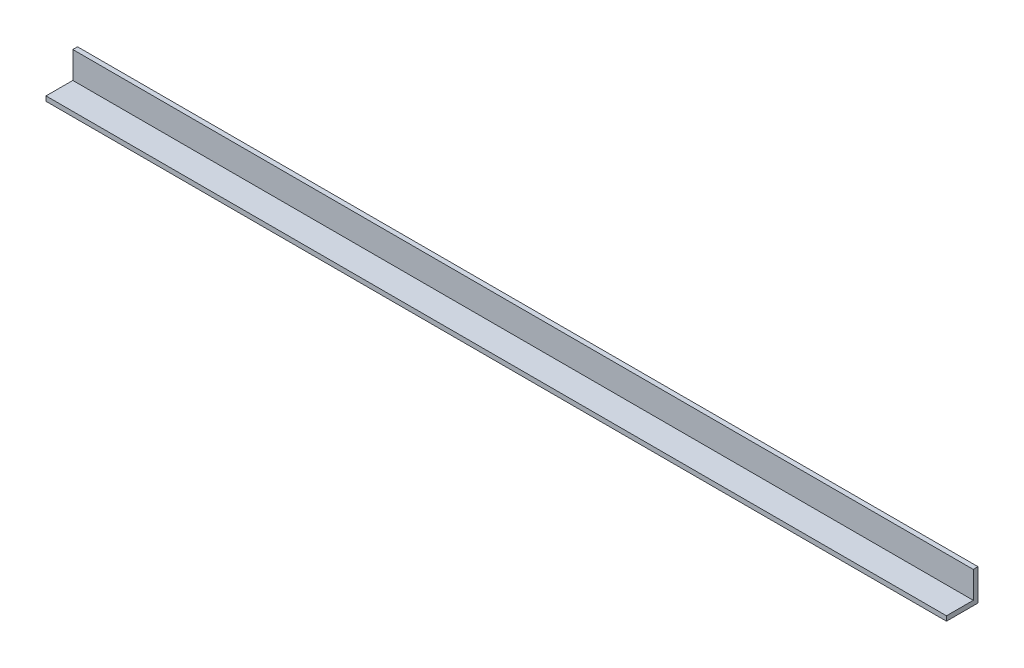
ISO-10303-21;
HEADER;
FILE_DESCRIPTION(('STEP AP214'),'2;1');
FILE_NAME('part.step','',(''),(''),'','','');
FILE_SCHEMA(('AUTOMOTIVE_DESIGN { 1 0 10303 214 1 1 1 1 }'));
ENDSEC;
DATA;
#1=APPLICATION_CONTEXT('core data for automotive mechanical design processes');
#2=APPLICATION_PROTOCOL_DEFINITION('international standard','automotive_design',2000,#1);
#3=PRODUCT_CONTEXT('',#1,'mechanical');
#4=PRODUCT('Part','Part','',(#3));
#5=PRODUCT_RELATED_PRODUCT_CATEGORY('part','',(#4));
#6=PRODUCT_DEFINITION_FORMATION('','',#4);
#7=PRODUCT_DEFINITION_CONTEXT('part definition',#1,'design');
#8=PRODUCT_DEFINITION('design','',#6,#7);
#9=PRODUCT_DEFINITION_SHAPE('','',#8);
#10=(LENGTH_UNIT() NAMED_UNIT(*) SI_UNIT(.MILLI.,.METRE.));
#11=(NAMED_UNIT(*) PLANE_ANGLE_UNIT() SI_UNIT($,.RADIAN.));
#12=(NAMED_UNIT(*) SI_UNIT($,.STERADIAN.) SOLID_ANGLE_UNIT());
#13=UNCERTAINTY_MEASURE_WITH_UNIT(LENGTH_MEASURE(1.E-05),#10,'distance_accuracy_value','');
#14=(GEOMETRIC_REPRESENTATION_CONTEXT(3) GLOBAL_UNCERTAINTY_ASSIGNED_CONTEXT((#13)) GLOBAL_UNIT_ASSIGNED_CONTEXT((#10,
#11,#12)) REPRESENTATION_CONTEXT('',''));
#15=CARTESIAN_POINT('',(0.,0.,0.));
#16=DIRECTION('',(0.,0.,1.));
#17=DIRECTION('',(1.,0.,0.));
#18=AXIS2_PLACEMENT_3D('',#15,#16,#17);
#19=CARTESIAN_POINT('',(0.,0.,80.));
#20=DIRECTION('',(1.,0.,0.));
#21=DIRECTION('',(0.,0.,-1.));
#22=AXIS2_PLACEMENT_3D('',#19,#20,#21);
#23=PLANE('',#22);
#24=DIRECTION('',(0.,0.,1.));
#25=VECTOR('',#24,1.);
#26=CARTESIAN_POINT('',(0.,12.,12.));
#27=LINE('',#26,#25);
#28=CARTESIAN_POINT('',(0.,12.,12.));
#29=VERTEX_POINT('',#28);
#30=CARTESIAN_POINT('',(0.,12.,80.));
#31=VERTEX_POINT('',#30);
#32=EDGE_CURVE('E46',#29,#31,#27,.T.);
#33=ORIENTED_EDGE('',*,*,#32,.F.);
#34=DIRECTION('',(0.,-1.,0.));
#35=VECTOR('',#34,1.);
#36=CARTESIAN_POINT('',(0.,80.,12.));
#37=LINE('',#36,#35);
#38=CARTESIAN_POINT('',(0.,80.,12.));
#39=VERTEX_POINT('',#38);
#40=EDGE_CURVE('E82',#39,#29,#37,.T.);
#41=ORIENTED_EDGE('',*,*,#40,.F.);
#42=DIRECTION('',(0.,0.,-1.));
#43=VECTOR('',#42,1.);
#44=CARTESIAN_POINT('',(0.,80.,80.));
#45=LINE('',#44,#43);
#46=CARTESIAN_POINT('',(0.,80.,0.));
#47=VERTEX_POINT('',#46);
#48=EDGE_CURVE('E75',#39,#47,#45,.T.);
#49=ORIENTED_EDGE('',*,*,#48,.T.);
#50=DIRECTION('',(0.,-1.,0.));
#51=VECTOR('',#50,1.);
#52=CARTESIAN_POINT('',(0.,0.,0.));
#53=LINE('',#52,#51);
#54=CARTESIAN_POINT('',(0.,0.,0.));
#55=VERTEX_POINT('',#54);
#56=EDGE_CURVE('E79',#47,#55,#53,.T.);
#57=ORIENTED_EDGE('',*,*,#56,.T.);
#58=DIRECTION('',(0.,0.,-1.));
#59=VECTOR('',#58,1.);
#60=CARTESIAN_POINT('',(0.,0.,80.));
#61=LINE('',#60,#59);
#62=CARTESIAN_POINT('',(0.,0.,80.));
#63=VERTEX_POINT('',#62);
#64=EDGE_CURVE('E11',#63,#55,#61,.T.);
#65=ORIENTED_EDGE('',*,*,#64,.F.);
#66=DIRECTION('',(0.,-1.,0.));
#67=VECTOR('',#66,1.);
#68=CARTESIAN_POINT('',(0.,0.,80.));
#69=LINE('',#68,#67);
#70=EDGE_CURVE('E95',#31,#63,#69,.T.);
#71=ORIENTED_EDGE('',*,*,#70,.F.);
#72=EDGE_LOOP('',(#33,#41,#49,#57,#65,#71));
#73=FACE_BOUND('',#72,.T.);
#74=ADVANCED_FACE('F32',(#73),#23,.F.);
#75=CARTESIAN_POINT('',(0.,0.,80.));
#76=DIRECTION('',(0.,1.,0.));
#77=DIRECTION('',(0.,0.,1.));
#78=AXIS2_PLACEMENT_3D('',#75,#76,#77);
#79=PLANE('',#78);
#80=DIRECTION('',(1.,0.,0.));
#81=VECTOR('',#80,1.);
#82=CARTESIAN_POINT('',(0.,0.,0.));
#83=LINE('',#82,#81);
#84=CARTESIAN_POINT('',(2286.,0.,0.));
#85=VERTEX_POINT('',#84);
#86=EDGE_CURVE('E99',#55,#85,#83,.T.);
#87=ORIENTED_EDGE('',*,*,#86,.T.);
#88=DIRECTION('',(0.,0.,-1.));
#89=VECTOR('',#88,1.);
#90=CARTESIAN_POINT('',(2286.,0.,80.));
#91=LINE('',#90,#89);
#92=CARTESIAN_POINT('',(2286.,0.,80.));
#93=VERTEX_POINT('',#92);
#94=EDGE_CURVE('E39',#93,#85,#91,.T.);
#95=ORIENTED_EDGE('',*,*,#94,.F.);
#96=DIRECTION('',(1.,0.,0.));
#97=VECTOR('',#96,1.);
#98=CARTESIAN_POINT('',(0.,0.,80.));
#99=LINE('',#98,#97);
#100=EDGE_CURVE('E55',#63,#93,#99,.T.);
#101=ORIENTED_EDGE('',*,*,#100,.F.);
#102=ORIENTED_EDGE('',*,*,#64,.T.);
#103=EDGE_LOOP('',(#87,#95,#101,#102));
#104=FACE_BOUND('',#103,.T.);
#105=ADVANCED_FACE('F116',(#104),#79,.F.);
#106=CARTESIAN_POINT('',(2286.,0.,80.));
#107=DIRECTION('',(-1.,0.,0.));
#108=DIRECTION('',(0.,0.,1.));
#109=AXIS2_PLACEMENT_3D('',#106,#107,#108);
#110=PLANE('',#109);
#111=DIRECTION('',(0.,0.,-1.));
#112=VECTOR('',#111,1.);
#113=CARTESIAN_POINT('',(2286.,80.,80.));
#114=LINE('',#113,#112);
#115=CARTESIAN_POINT('',(2286.,80.,12.));
#116=VERTEX_POINT('',#115);
#117=CARTESIAN_POINT('',(2286.,80.,0.));
#118=VERTEX_POINT('',#117);
#119=EDGE_CURVE('E85',#116,#118,#114,.T.);
#120=ORIENTED_EDGE('',*,*,#119,.F.);
#121=DIRECTION('',(0.,-1.,0.));
#122=VECTOR('',#121,1.);
#123=CARTESIAN_POINT('',(2286.,80.,12.));
#124=LINE('',#123,#122);
#125=CARTESIAN_POINT('',(2286.,12.,12.));
#126=VERTEX_POINT('',#125);
#127=EDGE_CURVE('E126',#116,#126,#124,.T.);
#128=ORIENTED_EDGE('',*,*,#127,.T.);
#129=DIRECTION('',(0.,0.,1.));
#130=VECTOR('',#129,1.);
#131=CARTESIAN_POINT('',(2286.,12.,12.));
#132=LINE('',#131,#130);
#133=CARTESIAN_POINT('',(2286.,12.,80.));
#134=VERTEX_POINT('',#133);
#135=EDGE_CURVE('E123',#126,#134,#132,.T.);
#136=ORIENTED_EDGE('',*,*,#135,.T.);
#137=DIRECTION('',(0.,1.,0.));
#138=VECTOR('',#137,1.);
#139=CARTESIAN_POINT('',(2286.,0.,80.));
#140=LINE('',#139,#138);
#141=EDGE_CURVE('E86',#93,#134,#140,.T.);
#142=ORIENTED_EDGE('',*,*,#141,.F.);
#143=ORIENTED_EDGE('',*,*,#94,.T.);
#144=DIRECTION('',(0.,1.,0.));
#145=VECTOR('',#144,1.);
#146=CARTESIAN_POINT('',(2286.,0.,0.));
#147=LINE('',#146,#145);
#148=EDGE_CURVE('E96',#85,#118,#147,.T.);
#149=ORIENTED_EDGE('',*,*,#148,.T.);
#150=EDGE_LOOP('',(#120,#128,#136,#142,#143,#149));
#151=FACE_BOUND('',#150,.T.);
#152=ADVANCED_FACE('F113',(#151),#110,.F.);
#153=CARTESIAN_POINT('',(0.,80.,80.));
#154=DIRECTION('',(0.,-1.,0.));
#155=DIRECTION('',(0.,0.,-1.));
#156=AXIS2_PLACEMENT_3D('',#153,#154,#155);
#157=PLANE('',#156);
#158=ORIENTED_EDGE('',*,*,#48,.F.);
#159=DIRECTION('',(-1.,0.,0.));
#160=VECTOR('',#159,1.);
#161=CARTESIAN_POINT('',(2286.,80.,12.));
#162=LINE('',#161,#160);
#163=EDGE_CURVE('E100',#116,#39,#162,.T.);
#164=ORIENTED_EDGE('',*,*,#163,.F.);
#165=ORIENTED_EDGE('',*,*,#119,.T.);
#166=DIRECTION('',(-1.,0.,0.));
#167=VECTOR('',#166,1.);
#168=CARTESIAN_POINT('',(0.,80.,0.));
#169=LINE('',#168,#167);
#170=EDGE_CURVE('E89',#118,#47,#169,.T.);
#171=ORIENTED_EDGE('',*,*,#170,.T.);
#172=EDGE_LOOP('',(#158,#164,#165,#171));
#173=FACE_BOUND('',#172,.T.);
#174=ADVANCED_FACE('F90',(#173),#157,.F.);
#175=CARTESIAN_POINT('',(0.,80.,80.));
#176=DIRECTION('',(0.,0.,-1.));
#177=DIRECTION('',(-1.,0.,0.));
#178=AXIS2_PLACEMENT_3D('',#175,#176,#177);
#179=PLANE('',#178);
#180=ORIENTED_EDGE('',*,*,#141,.T.);
#181=DIRECTION('',(-1.,0.,0.));
#182=VECTOR('',#181,1.);
#183=CARTESIAN_POINT('',(2286.,12.,80.));
#184=LINE('',#183,#182);
#185=EDGE_CURVE('E104',#134,#31,#184,.T.);
#186=ORIENTED_EDGE('',*,*,#185,.T.);
#187=ORIENTED_EDGE('',*,*,#70,.T.);
#188=ORIENTED_EDGE('',*,*,#100,.T.);
#189=EDGE_LOOP('',(#180,#186,#187,#188));
#190=FACE_BOUND('',#189,.T.);
#191=ADVANCED_FACE('F142',(#190),#179,.F.);
#192=CARTESIAN_POINT('',(0.,80.,0.));
#193=DIRECTION('',(0.,0.,-1.));
#194=DIRECTION('',(-1.,0.,0.));
#195=AXIS2_PLACEMENT_3D('',#192,#193,#194);
#196=PLANE('',#195);
#197=ORIENTED_EDGE('',*,*,#56,.F.);
#198=ORIENTED_EDGE('',*,*,#170,.F.);
#199=ORIENTED_EDGE('',*,*,#148,.F.);
#200=ORIENTED_EDGE('',*,*,#86,.F.);
#201=EDGE_LOOP('',(#197,#198,#199,#200));
#202=FACE_BOUND('',#201,.T.);
#203=ADVANCED_FACE('F98',(#202),#196,.T.);
#204=CARTESIAN_POINT('',(2286.,80.,12.));
#205=DIRECTION('',(0.,0.,-1.));
#206=DIRECTION('',(0.,1.,0.));
#207=AXIS2_PLACEMENT_3D('',#204,#205,#206);
#208=PLANE('',#207);
#209=ORIENTED_EDGE('',*,*,#40,.T.);
#210=DIRECTION('',(-1.,0.,0.));
#211=VECTOR('',#210,1.);
#212=CARTESIAN_POINT('',(2286.,12.,12.));
#213=LINE('',#212,#211);
#214=EDGE_CURVE('E121',#126,#29,#213,.T.);
#215=ORIENTED_EDGE('',*,*,#214,.F.);
#216=ORIENTED_EDGE('',*,*,#127,.F.);
#217=ORIENTED_EDGE('',*,*,#163,.T.);
#218=EDGE_LOOP('',(#209,#215,#216,#217));
#219=FACE_BOUND('',#218,.T.);
#220=ADVANCED_FACE('F137',(#219),#208,.F.);
#221=CARTESIAN_POINT('',(2286.,12.,12.));
#222=DIRECTION('',(0.,-1.,0.));
#223=DIRECTION('',(0.,0.,-1.));
#224=AXIS2_PLACEMENT_3D('',#221,#222,#223);
#225=PLANE('',#224);
#226=ORIENTED_EDGE('',*,*,#32,.T.);
#227=ORIENTED_EDGE('',*,*,#185,.F.);
#228=ORIENTED_EDGE('',*,*,#135,.F.);
#229=ORIENTED_EDGE('',*,*,#214,.T.);
#230=EDGE_LOOP('',(#226,#227,#228,#229));
#231=FACE_BOUND('',#230,.T.);
#232=ADVANCED_FACE('F141',(#231),#225,.F.);
#233=CLOSED_SHELL('',(#74,#105,#152,#174,#191,#203,#220,#232));
#234=MANIFOLD_SOLID_BREP('B2',#233);
#235=ADVANCED_BREP_SHAPE_REPRESENTATION('',(#18,#234),#14);
#236=SHAPE_DEFINITION_REPRESENTATION(#9,#235);
ENDSEC;
END-ISO-10303-21;
